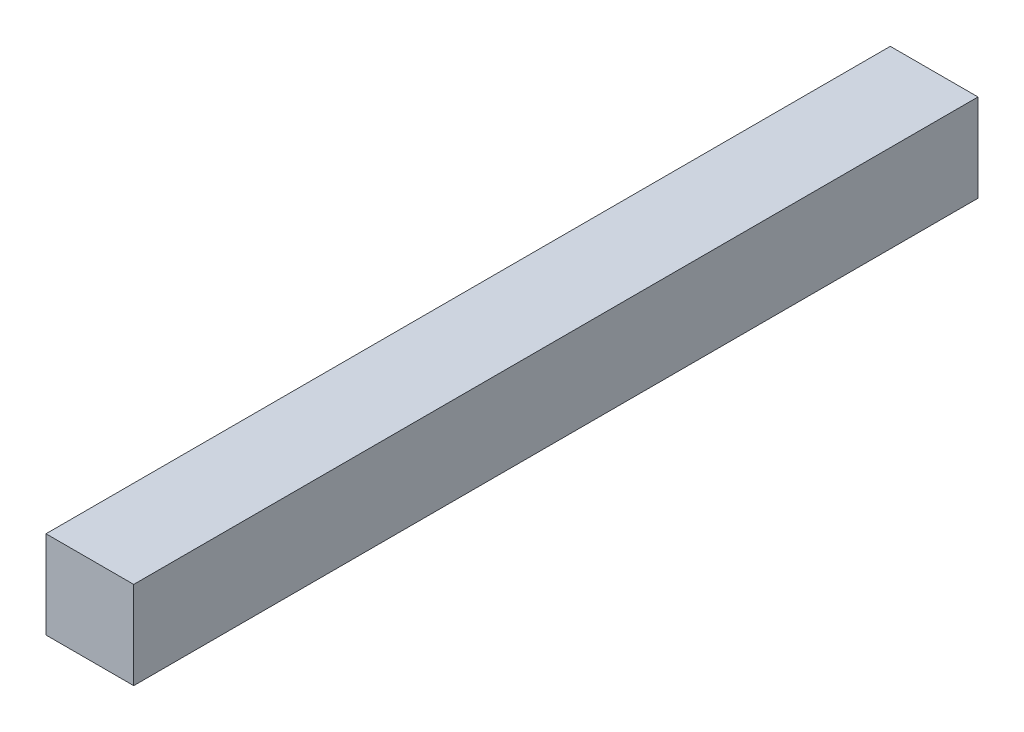
ISO-10303-21;
HEADER;
FILE_DESCRIPTION(('STEP AP214'),'2;1');
FILE_NAME('part.step','',(''),(''),'','','');
FILE_SCHEMA(('AUTOMOTIVE_DESIGN { 1 0 10303 214 1 1 1 1 }'));
ENDSEC;
DATA;
#1=APPLICATION_CONTEXT('core data for automotive mechanical design processes');
#2=APPLICATION_PROTOCOL_DEFINITION('international standard','automotive_design',2000,#1);
#3=PRODUCT_CONTEXT('',#1,'mechanical');
#4=PRODUCT('Part','Part','',(#3));
#5=PRODUCT_RELATED_PRODUCT_CATEGORY('part','',(#4));
#6=PRODUCT_DEFINITION_FORMATION('','',#4);
#7=PRODUCT_DEFINITION_CONTEXT('part definition',#1,'design');
#8=PRODUCT_DEFINITION('design','',#6,#7);
#9=PRODUCT_DEFINITION_SHAPE('','',#8);
#10=(LENGTH_UNIT() NAMED_UNIT(*) SI_UNIT(.MILLI.,.METRE.));
#11=(NAMED_UNIT(*) PLANE_ANGLE_UNIT() SI_UNIT($,.RADIAN.));
#12=(NAMED_UNIT(*) SI_UNIT($,.STERADIAN.) SOLID_ANGLE_UNIT());
#13=UNCERTAINTY_MEASURE_WITH_UNIT(LENGTH_MEASURE(1.E-05),#10,'distance_accuracy_value','');
#14=(GEOMETRIC_REPRESENTATION_CONTEXT(3) GLOBAL_UNCERTAINTY_ASSIGNED_CONTEXT((#13)) GLOBAL_UNIT_ASSIGNED_CONTEXT((#10,
#11,#12)) REPRESENTATION_CONTEXT('',''));
#15=CARTESIAN_POINT('',(0.,0.,0.));
#16=DIRECTION('',(0.,0.,1.));
#17=DIRECTION('',(1.,0.,0.));
#18=AXIS2_PLACEMENT_3D('',#15,#16,#17);
#19=CARTESIAN_POINT('',(4.,-4.,38.5));
#20=DIRECTION('',(-1.,0.,0.));
#21=DIRECTION('',(0.,0.,1.));
#22=AXIS2_PLACEMENT_3D('',#19,#20,#21);
#23=PLANE('',#22);
#24=DIRECTION('',(0.,1.,0.));
#25=VECTOR('',#24,1.);
#26=CARTESIAN_POINT('',(4.,-4.,-38.5));
#27=LINE('',#26,#25);
#28=CARTESIAN_POINT('',(4.,-4.,-38.5));
#29=VERTEX_POINT('',#28);
#30=CARTESIAN_POINT('',(4.,4.,-38.5));
#31=VERTEX_POINT('',#30);
#32=EDGE_CURVE('E98',#29,#31,#27,.T.);
#33=ORIENTED_EDGE('',*,*,#32,.T.);
#34=DIRECTION('',(0.,0.,-1.));
#35=VECTOR('',#34,1.);
#36=CARTESIAN_POINT('',(4.,4.,38.5));
#37=LINE('',#36,#35);
#38=CARTESIAN_POINT('',(4.,4.,38.5));
#39=VERTEX_POINT('',#38);
#40=EDGE_CURVE('E11',#39,#31,#37,.T.);
#41=ORIENTED_EDGE('',*,*,#40,.F.);
#42=DIRECTION('',(0.,1.,0.));
#43=VECTOR('',#42,1.);
#44=CARTESIAN_POINT('',(4.,-4.,38.5));
#45=LINE('',#44,#43);
#46=CARTESIAN_POINT('',(4.,-4.,38.5));
#47=VERTEX_POINT('',#46);
#48=EDGE_CURVE('E86',#47,#39,#45,.T.);
#49=ORIENTED_EDGE('',*,*,#48,.F.);
#50=DIRECTION('',(0.,0.,-1.));
#51=VECTOR('',#50,1.);
#52=CARTESIAN_POINT('',(4.,-4.,38.5));
#53=LINE('',#52,#51);
#54=EDGE_CURVE('E94',#47,#29,#53,.T.);
#55=ORIENTED_EDGE('',*,*,#54,.T.);
#56=EDGE_LOOP('',(#33,#41,#49,#55));
#57=FACE_BOUND('',#56,.T.);
#58=ADVANCED_FACE('F35',(#57),#23,.F.);
#59=CARTESIAN_POINT('',(-4.,4.,38.5));
#60=DIRECTION('',(0.,-1.,0.));
#61=DIRECTION('',(0.,0.,-1.));
#62=AXIS2_PLACEMENT_3D('',#59,#60,#61);
#63=PLANE('',#62);
#64=DIRECTION('',(-1.,0.,0.));
#65=VECTOR('',#64,1.);
#66=CARTESIAN_POINT('',(-4.,4.,-38.5));
#67=LINE('',#66,#65);
#68=CARTESIAN_POINT('',(-4.,4.,-38.5));
#69=VERTEX_POINT('',#68);
#70=EDGE_CURVE('E90',#31,#69,#67,.T.);
#71=ORIENTED_EDGE('',*,*,#70,.T.);
#72=DIRECTION('',(0.,0.,-1.));
#73=VECTOR('',#72,1.);
#74=CARTESIAN_POINT('',(-4.,4.,38.5));
#75=LINE('',#74,#73);
#76=CARTESIAN_POINT('',(-4.,4.,38.5));
#77=VERTEX_POINT('',#76);
#78=EDGE_CURVE('E43',#77,#69,#75,.T.);
#79=ORIENTED_EDGE('',*,*,#78,.F.);
#80=DIRECTION('',(-1.,0.,0.));
#81=VECTOR('',#80,1.);
#82=CARTESIAN_POINT('',(-4.,4.,38.5));
#83=LINE('',#82,#81);
#84=EDGE_CURVE('E81',#39,#77,#83,.T.);
#85=ORIENTED_EDGE('',*,*,#84,.F.);
#86=ORIENTED_EDGE('',*,*,#40,.T.);
#87=EDGE_LOOP('',(#71,#79,#85,#86));
#88=FACE_BOUND('',#87,.T.);
#89=ADVANCED_FACE('F89',(#88),#63,.F.);
#90=CARTESIAN_POINT('',(-4.,-4.,38.5));
#91=DIRECTION('',(1.,0.,0.));
#92=DIRECTION('',(0.,0.,-1.));
#93=AXIS2_PLACEMENT_3D('',#90,#91,#92);
#94=PLANE('',#93);
#95=DIRECTION('',(0.,-1.,0.));
#96=VECTOR('',#95,1.);
#97=CARTESIAN_POINT('',(-4.,-4.,-38.5));
#98=LINE('',#97,#96);
#99=CARTESIAN_POINT('',(-4.,-4.,-38.5));
#100=VERTEX_POINT('',#99);
#101=EDGE_CURVE('E68',#69,#100,#98,.T.);
#102=ORIENTED_EDGE('',*,*,#101,.T.);
#103=DIRECTION('',(0.,0.,-1.));
#104=VECTOR('',#103,1.);
#105=CARTESIAN_POINT('',(-4.,-4.,38.5));
#106=LINE('',#105,#104);
#107=CARTESIAN_POINT('',(-4.,-4.,38.5));
#108=VERTEX_POINT('',#107);
#109=EDGE_CURVE('E91',#108,#100,#106,.T.);
#110=ORIENTED_EDGE('',*,*,#109,.F.);
#111=DIRECTION('',(0.,-1.,0.));
#112=VECTOR('',#111,1.);
#113=CARTESIAN_POINT('',(-4.,-4.,38.5));
#114=LINE('',#113,#112);
#115=EDGE_CURVE('E84',#77,#108,#114,.T.);
#116=ORIENTED_EDGE('',*,*,#115,.F.);
#117=ORIENTED_EDGE('',*,*,#78,.T.);
#118=EDGE_LOOP('',(#102,#110,#116,#117));
#119=FACE_BOUND('',#118,.T.);
#120=ADVANCED_FACE('F92',(#119),#94,.F.);
#121=CARTESIAN_POINT('',(-4.,-4.,38.5));
#122=DIRECTION('',(0.,1.,0.));
#123=DIRECTION('',(0.,0.,1.));
#124=AXIS2_PLACEMENT_3D('',#121,#122,#123);
#125=PLANE('',#124);
#126=DIRECTION('',(1.,0.,0.));
#127=VECTOR('',#126,1.);
#128=CARTESIAN_POINT('',(-4.,-4.,-38.5));
#129=LINE('',#128,#127);
#130=EDGE_CURVE('E74',#100,#29,#129,.T.);
#131=ORIENTED_EDGE('',*,*,#130,.T.);
#132=ORIENTED_EDGE('',*,*,#54,.F.);
#133=DIRECTION('',(1.,0.,0.));
#134=VECTOR('',#133,1.);
#135=CARTESIAN_POINT('',(-4.,-4.,38.5));
#136=LINE('',#135,#134);
#137=EDGE_CURVE('E51',#108,#47,#136,.T.);
#138=ORIENTED_EDGE('',*,*,#137,.F.);
#139=ORIENTED_EDGE('',*,*,#109,.T.);
#140=EDGE_LOOP('',(#131,#132,#138,#139));
#141=FACE_BOUND('',#140,.T.);
#142=ADVANCED_FACE('F105',(#141),#125,.F.);
#143=CARTESIAN_POINT('',(0.,0.,38.5));
#144=DIRECTION('',(0.,0.,-1.));
#145=DIRECTION('',(-1.,0.,0.));
#146=AXIS2_PLACEMENT_3D('',#143,#144,#145);
#147=PLANE('',#146);
#148=ORIENTED_EDGE('',*,*,#48,.T.);
#149=ORIENTED_EDGE('',*,*,#84,.T.);
#150=ORIENTED_EDGE('',*,*,#115,.T.);
#151=ORIENTED_EDGE('',*,*,#137,.T.);
#152=EDGE_LOOP('',(#148,#149,#150,#151));
#153=FACE_BOUND('',#152,.T.);
#154=ADVANCED_FACE('F82',(#153),#147,.F.);
#155=CARTESIAN_POINT('',(0.,0.,-38.5));
#156=DIRECTION('',(0.,0.,-1.));
#157=DIRECTION('',(-1.,0.,0.));
#158=AXIS2_PLACEMENT_3D('',#155,#156,#157);
#159=PLANE('',#158);
#160=ORIENTED_EDGE('',*,*,#32,.F.);
#161=ORIENTED_EDGE('',*,*,#130,.F.);
#162=ORIENTED_EDGE('',*,*,#101,.F.);
#163=ORIENTED_EDGE('',*,*,#70,.F.);
#164=EDGE_LOOP('',(#160,#161,#162,#163));
#165=FACE_BOUND('',#164,.T.);
#166=ADVANCED_FACE('F108',(#165),#159,.T.);
#167=CLOSED_SHELL('',(#58,#89,#120,#142,#154,#166));
#168=MANIFOLD_SOLID_BREP('B2',#167);
#169=ADVANCED_BREP_SHAPE_REPRESENTATION('',(#18,#168),#14);
#170=SHAPE_DEFINITION_REPRESENTATION(#9,#169);
ENDSEC;
END-ISO-10303-21;
